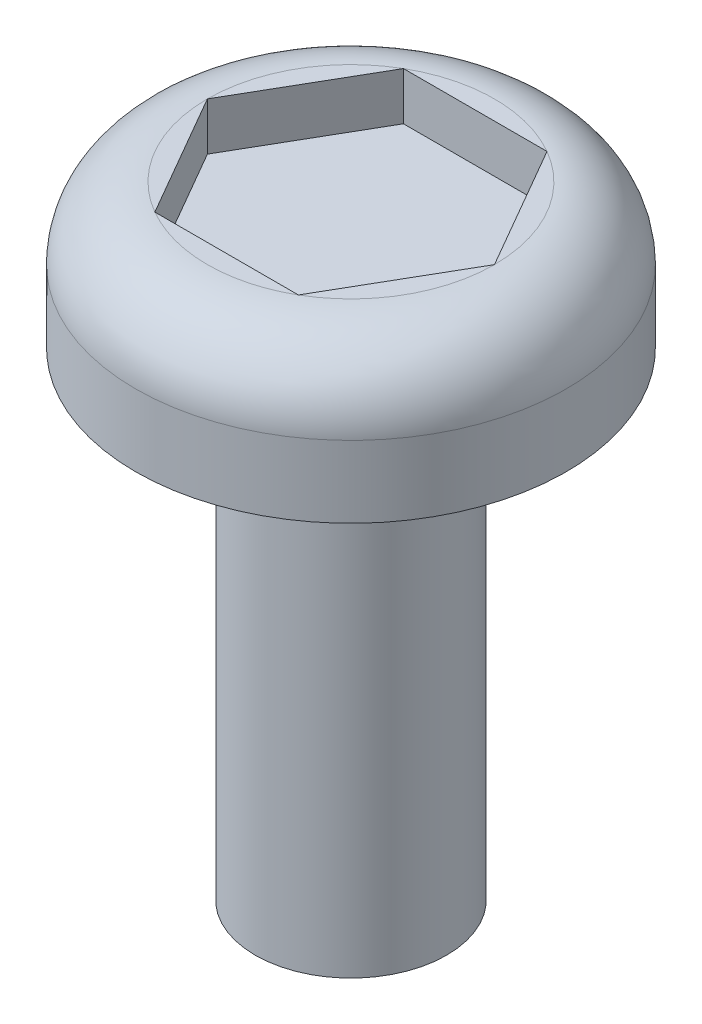
ISO-10303-21;
HEADER;
FILE_DESCRIPTION(('STEP AP214'),'2;1');
FILE_NAME('part.step','',(''),(''),'','','');
FILE_SCHEMA(('AUTOMOTIVE_DESIGN { 1 0 10303 214 1 1 1 1 }'));
ENDSEC;
DATA;
#1=APPLICATION_CONTEXT('core data for automotive mechanical design processes');
#2=APPLICATION_PROTOCOL_DEFINITION('international standard','automotive_design',2000,#1);
#3=PRODUCT_CONTEXT('',#1,'mechanical');
#4=PRODUCT('Part','Part','',(#3));
#5=PRODUCT_RELATED_PRODUCT_CATEGORY('part','',(#4));
#6=PRODUCT_DEFINITION_FORMATION('','',#4);
#7=PRODUCT_DEFINITION_CONTEXT('part definition',#1,'design');
#8=PRODUCT_DEFINITION('design','',#6,#7);
#9=PRODUCT_DEFINITION_SHAPE('','',#8);
#10=(LENGTH_UNIT() NAMED_UNIT(*) SI_UNIT(.MILLI.,.METRE.));
#11=(NAMED_UNIT(*) PLANE_ANGLE_UNIT() SI_UNIT($,.RADIAN.));
#12=(NAMED_UNIT(*) SI_UNIT($,.STERADIAN.) SOLID_ANGLE_UNIT());
#13=UNCERTAINTY_MEASURE_WITH_UNIT(LENGTH_MEASURE(1.E-05),#10,'distance_accuracy_value','');
#14=(GEOMETRIC_REPRESENTATION_CONTEXT(3) GLOBAL_UNCERTAINTY_ASSIGNED_CONTEXT((#13)) GLOBAL_UNIT_ASSIGNED_CONTEXT((#10,
#11,#12)) REPRESENTATION_CONTEXT('',''));
#15=CARTESIAN_POINT('',(0.,0.,0.));
#16=DIRECTION('',(0.,0.,1.));
#17=DIRECTION('',(1.,0.,0.));
#18=AXIS2_PLACEMENT_3D('',#15,#16,#17);
#19=CARTESIAN_POINT('',(0.,6.5,0.));
#20=DIRECTION('',(0.,1.,0.));
#21=DIRECTION('',(0.,0.,1.));
#22=AXIS2_PLACEMENT_3D('',#19,#20,#21);
#23=PLANE('',#22);
#24=DIRECTION('',(0.5,0.,-0.866025403784439));
#25=VECTOR('',#24,1.);
#26=CARTESIAN_POINT('',(0.75,6.5,1.29903810567666));
#27=LINE('',#26,#25);
#28=CARTESIAN_POINT('',(0.75,6.5,1.29903810567666));
#29=VERTEX_POINT('',#28);
#30=CARTESIAN_POINT('',(1.5,6.5,0.));
#31=VERTEX_POINT('',#30);
#32=EDGE_CURVE('E50',#29,#31,#27,.T.);
#33=ORIENTED_EDGE('',*,*,#32,.F.);
#34=CARTESIAN_POINT('',(0.,6.5,0.));
#35=DIRECTION('',(0.,1.,0.));
#36=DIRECTION('',(0.,0.,1.));
#37=AXIS2_PLACEMENT_3D('',#34,#35,#36);
#38=CIRCLE('',#37,1.5);
#39=EDGE_CURVE('E43',#29,#31,#38,.T.);
#40=ORIENTED_EDGE('',*,*,#39,.T.);
#41=EDGE_LOOP('',(#33,#40));
#42=FACE_BOUND('',#41,.T.);
#43=ADVANCED_FACE('F35',(#42),#23,.T.);
#44=DIRECTION('',(1.,0.,0.));
#45=VECTOR('',#44,1.);
#46=CARTESIAN_POINT('',(-0.75,6.5,1.29903810567666));
#47=LINE('',#46,#45);
#48=CARTESIAN_POINT('',(-0.75,6.5,1.29903810567666));
#49=VERTEX_POINT('',#48);
#50=EDGE_CURVE('E133',#49,#29,#47,.T.);
#51=ORIENTED_EDGE('',*,*,#50,.F.);
#52=EDGE_CURVE('E149',#49,#29,#38,.T.);
#53=ORIENTED_EDGE('',*,*,#52,.T.);
#54=EDGE_LOOP('',(#51,#53));
#55=FACE_BOUND('',#54,.T.);
#56=ADVANCED_FACE('F196',(#55),#23,.T.);
#57=DIRECTION('',(0.5,0.,0.866025403784439));
#58=VECTOR('',#57,1.);
#59=CARTESIAN_POINT('',(-1.5,6.5,0.));
#60=LINE('',#59,#58);
#61=CARTESIAN_POINT('',(-1.5,6.5,0.));
#62=VERTEX_POINT('',#61);
#63=EDGE_CURVE('E131',#62,#49,#60,.T.);
#64=ORIENTED_EDGE('',*,*,#63,.F.);
#65=EDGE_CURVE('E158',#62,#49,#38,.T.);
#66=ORIENTED_EDGE('',*,*,#65,.T.);
#67=EDGE_LOOP('',(#64,#66));
#68=FACE_BOUND('',#67,.T.);
#69=ADVANCED_FACE('F201',(#68),#23,.T.);
#70=DIRECTION('',(-0.5,0.,0.866025403784439));
#71=VECTOR('',#70,1.);
#72=CARTESIAN_POINT('',(-0.75,6.5,-1.29903810567666));
#73=LINE('',#72,#71);
#74=CARTESIAN_POINT('',(-0.75,6.5,-1.29903810567666));
#75=VERTEX_POINT('',#74);
#76=EDGE_CURVE('E98',#75,#62,#73,.T.);
#77=ORIENTED_EDGE('',*,*,#76,.F.);
#78=EDGE_CURVE('E163',#75,#62,#38,.T.);
#79=ORIENTED_EDGE('',*,*,#78,.T.);
#80=EDGE_LOOP('',(#77,#79));
#81=FACE_BOUND('',#80,.T.);
#82=ADVANCED_FACE('F215',(#81),#23,.T.);
#83=DIRECTION('',(-1.,0.,0.));
#84=VECTOR('',#83,1.);
#85=CARTESIAN_POINT('',(0.75,6.5,-1.29903810567666));
#86=LINE('',#85,#84);
#87=CARTESIAN_POINT('',(0.75,6.5,-1.29903810567666));
#88=VERTEX_POINT('',#87);
#89=EDGE_CURVE('E127',#88,#75,#86,.T.);
#90=ORIENTED_EDGE('',*,*,#89,.F.);
#91=EDGE_CURVE('E156',#88,#75,#38,.T.);
#92=ORIENTED_EDGE('',*,*,#91,.T.);
#93=EDGE_LOOP('',(#90,#92));
#94=FACE_BOUND('',#93,.T.);
#95=ADVANCED_FACE('F173',(#94),#23,.T.);
#96=CARTESIAN_POINT('',(0.,5.,0.));
#97=DIRECTION('',(0.,-1.,0.));
#98=DIRECTION('',(0.,0.,-1.));
#99=AXIS2_PLACEMENT_3D('',#96,#97,#98);
#100=CYLINDRICAL_SURFACE('',#99,1.);
#101=CARTESIAN_POINT('',(0.,5.,0.));
#102=DIRECTION('',(0.,1.,0.));
#103=DIRECTION('',(0.,0.,1.));
#104=AXIS2_PLACEMENT_3D('',#101,#102,#103);
#105=CIRCLE('',#104,1.);
#106=CARTESIAN_POINT('',(0.,5.,1.));
#107=VERTEX_POINT('',#106);
#108=EDGE_CURVE('E146',#107,#107,#105,.T.);
#109=ORIENTED_EDGE('',*,*,#108,.F.);
#110=EDGE_LOOP('',(#109));
#111=FACE_BOUND('',#110,.T.);
#112=CARTESIAN_POINT('',(0.,0.,0.));
#113=DIRECTION('',(0.,1.,0.));
#114=DIRECTION('',(0.,0.,1.));
#115=AXIS2_PLACEMENT_3D('',#112,#113,#114);
#116=CIRCLE('',#115,1.);
#117=CARTESIAN_POINT('',(0.,0.,1.));
#118=VERTEX_POINT('',#117);
#119=EDGE_CURVE('E145',#118,#118,#116,.T.);
#120=ORIENTED_EDGE('',*,*,#119,.T.);
#121=EDGE_LOOP('',(#120));
#122=FACE_BOUND('',#121,.T.);
#123=ADVANCED_FACE('F214',(#111,#122),#100,.T.);
#124=CARTESIAN_POINT('',(0.,0.,0.));
#125=DIRECTION('',(0.,1.,0.));
#126=DIRECTION('',(0.,0.,1.));
#127=AXIS2_PLACEMENT_3D('',#124,#125,#126);
#128=PLANE('',#127);
#129=ORIENTED_EDGE('',*,*,#119,.F.);
#130=EDGE_LOOP('',(#129));
#131=FACE_BOUND('',#130,.T.);
#132=ADVANCED_FACE('F210',(#131),#128,.F.);
#133=CARTESIAN_POINT('',(0.,6.5,0.));
#134=DIRECTION('',(0.,-1.,0.));
#135=DIRECTION('',(0.,0.,-1.));
#136=AXIS2_PLACEMENT_3D('',#133,#134,#135);
#137=CYLINDRICAL_SURFACE('',#136,2.25);
#138=CARTESIAN_POINT('',(0.,5.75,0.));
#139=DIRECTION('',(0.,1.,0.));
#140=DIRECTION('',(0.,0.,1.));
#141=AXIS2_PLACEMENT_3D('',#138,#139,#140);
#142=CIRCLE('',#141,2.25);
#143=CARTESIAN_POINT('',(0.,5.75,2.25));
#144=VERTEX_POINT('',#143);
#145=EDGE_CURVE('E11',#144,#144,#142,.F.);
#146=ORIENTED_EDGE('',*,*,#145,.T.);
#147=EDGE_LOOP('',(#146));
#148=FACE_BOUND('',#147,.T.);
#149=CARTESIAN_POINT('',(0.,5.,0.));
#150=DIRECTION('',(0.,1.,0.));
#151=DIRECTION('',(0.,0.,1.));
#152=AXIS2_PLACEMENT_3D('',#149,#150,#151);
#153=CIRCLE('',#152,2.25);
#154=CARTESIAN_POINT('',(0.,5.,2.25));
#155=VERTEX_POINT('',#154);
#156=EDGE_CURVE('E137',#155,#155,#153,.T.);
#157=ORIENTED_EDGE('',*,*,#156,.T.);
#158=EDGE_LOOP('',(#157));
#159=FACE_BOUND('',#158,.T.);
#160=ADVANCED_FACE('F204',(#148,#159),#137,.T.);
#161=DIRECTION('',(-0.5,0.,-0.866025403784439));
#162=VECTOR('',#161,1.);
#163=CARTESIAN_POINT('',(1.5,6.5,0.));
#164=LINE('',#163,#162);
#165=EDGE_CURVE('E124',#31,#88,#164,.T.);
#166=ORIENTED_EDGE('',*,*,#165,.F.);
#167=EDGE_CURVE('E152',#31,#88,#38,.T.);
#168=ORIENTED_EDGE('',*,*,#167,.T.);
#169=EDGE_LOOP('',(#166,#168));
#170=FACE_BOUND('',#169,.T.);
#171=ADVANCED_FACE('F178',(#170),#23,.T.);
#172=CARTESIAN_POINT('',(0.,5.,0.));
#173=DIRECTION('',(0.,1.,0.));
#174=DIRECTION('',(0.,0.,1.));
#175=AXIS2_PLACEMENT_3D('',#172,#173,#174);
#176=PLANE('',#175);
#177=ORIENTED_EDGE('',*,*,#108,.T.);
#178=EDGE_LOOP('',(#177));
#179=FACE_BOUND('',#178,.T.);
#180=ORIENTED_EDGE('',*,*,#156,.F.);
#181=EDGE_LOOP('',(#180));
#182=FACE_BOUND('',#181,.T.);
#183=ADVANCED_FACE('F191',(#179,#182),#176,.F.);
#184=CARTESIAN_POINT('',(0.,5.75,0.));
#185=DIRECTION('',(0.,1.,0.));
#186=DIRECTION('',(0.,0.,1.));
#187=AXIS2_PLACEMENT_3D('',#184,#185,#186);
#188=TOROIDAL_SURFACE('',#187,1.5,0.75);
#189=ORIENTED_EDGE('',*,*,#145,.F.);
#190=EDGE_LOOP('',(#189));
#191=FACE_BOUND('',#190,.T.);
#192=ORIENTED_EDGE('',*,*,#39,.F.);
#193=ORIENTED_EDGE('',*,*,#52,.F.);
#194=ORIENTED_EDGE('',*,*,#65,.F.);
#195=ORIENTED_EDGE('',*,*,#78,.F.);
#196=ORIENTED_EDGE('',*,*,#91,.F.);
#197=ORIENTED_EDGE('',*,*,#167,.F.);
#198=EDGE_LOOP('',(#192,#193,#194,#195,#196,#197));
#199=FACE_BOUND('',#198,.T.);
#200=ADVANCED_FACE('F37',(#191,#199),#188,.T.);
#201=CARTESIAN_POINT('',(0.75,6.,1.29903810567666));
#202=DIRECTION('',(0.866025403784439,0.,0.5));
#203=DIRECTION('',(0.5,0.,-0.866025403784439));
#204=AXIS2_PLACEMENT_3D('',#201,#202,#203);
#205=PLANE('',#204);
#206=ORIENTED_EDGE('',*,*,#32,.T.);
#207=DIRECTION('',(0.,1.,0.));
#208=VECTOR('',#207,1.);
#209=CARTESIAN_POINT('',(1.5,6.,0.));
#210=LINE('',#209,#208);
#211=CARTESIAN_POINT('',(1.5,6.,0.));
#212=VERTEX_POINT('',#211);
#213=EDGE_CURVE('E80',#212,#31,#210,.T.);
#214=ORIENTED_EDGE('',*,*,#213,.F.);
#215=DIRECTION('',(0.5,0.,-0.866025403784439));
#216=VECTOR('',#215,1.);
#217=CARTESIAN_POINT('',(0.75,6.,1.29903810567666));
#218=LINE('',#217,#216);
#219=CARTESIAN_POINT('',(0.75,6.,1.29903810567666));
#220=VERTEX_POINT('',#219);
#221=EDGE_CURVE('E135',#220,#212,#218,.T.);
#222=ORIENTED_EDGE('',*,*,#221,.F.);
#223=DIRECTION('',(0.,1.,0.));
#224=VECTOR('',#223,1.);
#225=CARTESIAN_POINT('',(0.75,6.,1.29903810567666));
#226=LINE('',#225,#224);
#227=EDGE_CURVE('E58',#220,#29,#226,.T.);
#228=ORIENTED_EDGE('',*,*,#227,.T.);
#229=EDGE_LOOP('',(#206,#214,#222,#228));
#230=FACE_BOUND('',#229,.T.);
#231=ADVANCED_FACE('F182',(#230),#205,.F.);
#232=CARTESIAN_POINT('',(-0.75,6.,1.29903810567666));
#233=DIRECTION('',(0.,0.,1.));
#234=DIRECTION('',(1.,0.,0.));
#235=AXIS2_PLACEMENT_3D('',#232,#233,#234);
#236=PLANE('',#235);
#237=ORIENTED_EDGE('',*,*,#50,.T.);
#238=ORIENTED_EDGE('',*,*,#227,.F.);
#239=DIRECTION('',(1.,0.,0.));
#240=VECTOR('',#239,1.);
#241=CARTESIAN_POINT('',(-0.75,6.,1.29903810567666));
#242=LINE('',#241,#240);
#243=CARTESIAN_POINT('',(-0.75,6.,1.29903810567666));
#244=VERTEX_POINT('',#243);
#245=EDGE_CURVE('E110',#244,#220,#242,.T.);
#246=ORIENTED_EDGE('',*,*,#245,.F.);
#247=DIRECTION('',(0.,1.,0.));
#248=VECTOR('',#247,1.);
#249=CARTESIAN_POINT('',(-0.75,6.,1.29903810567666));
#250=LINE('',#249,#248);
#251=EDGE_CURVE('E102',#244,#49,#250,.T.);
#252=ORIENTED_EDGE('',*,*,#251,.T.);
#253=EDGE_LOOP('',(#237,#238,#246,#252));
#254=FACE_BOUND('',#253,.T.);
#255=ADVANCED_FACE('F184',(#254),#236,.F.);
#256=CARTESIAN_POINT('',(-1.5,6.,0.));
#257=DIRECTION('',(-0.866025403784439,0.,0.5));
#258=DIRECTION('',(0.5,0.,0.866025403784439));
#259=AXIS2_PLACEMENT_3D('',#256,#257,#258);
#260=PLANE('',#259);
#261=ORIENTED_EDGE('',*,*,#63,.T.);
#262=ORIENTED_EDGE('',*,*,#251,.F.);
#263=DIRECTION('',(0.5,0.,0.866025403784439));
#264=VECTOR('',#263,1.);
#265=CARTESIAN_POINT('',(-1.5,6.,0.));
#266=LINE('',#265,#264);
#267=CARTESIAN_POINT('',(-1.5,6.,0.));
#268=VERTEX_POINT('',#267);
#269=EDGE_CURVE('E106',#268,#244,#266,.T.);
#270=ORIENTED_EDGE('',*,*,#269,.F.);
#271=DIRECTION('',(0.,1.,0.));
#272=VECTOR('',#271,1.);
#273=CARTESIAN_POINT('',(-1.5,6.,0.));
#274=LINE('',#273,#272);
#275=EDGE_CURVE('E91',#268,#62,#274,.T.);
#276=ORIENTED_EDGE('',*,*,#275,.T.);
#277=EDGE_LOOP('',(#261,#262,#270,#276));
#278=FACE_BOUND('',#277,.T.);
#279=ADVANCED_FACE('F107',(#278),#260,.F.);
#280=CARTESIAN_POINT('',(-0.75,6.,-1.29903810567666));
#281=DIRECTION('',(-0.866025403784439,0.,-0.5));
#282=DIRECTION('',(-0.5,0.,0.866025403784439));
#283=AXIS2_PLACEMENT_3D('',#280,#281,#282);
#284=PLANE('',#283);
#285=ORIENTED_EDGE('',*,*,#76,.T.);
#286=ORIENTED_EDGE('',*,*,#275,.F.);
#287=DIRECTION('',(-0.5,0.,0.866025403784439));
#288=VECTOR('',#287,1.);
#289=CARTESIAN_POINT('',(-0.75,6.,-1.29903810567666));
#290=LINE('',#289,#288);
#291=CARTESIAN_POINT('',(-0.75,6.,-1.29903810567666));
#292=VERTEX_POINT('',#291);
#293=EDGE_CURVE('E95',#292,#268,#290,.T.);
#294=ORIENTED_EDGE('',*,*,#293,.F.);
#295=DIRECTION('',(0.,1.,0.));
#296=VECTOR('',#295,1.);
#297=CARTESIAN_POINT('',(-0.75,6.,-1.29903810567666));
#298=LINE('',#297,#296);
#299=EDGE_CURVE('E103',#292,#75,#298,.T.);
#300=ORIENTED_EDGE('',*,*,#299,.T.);
#301=EDGE_LOOP('',(#285,#286,#294,#300));
#302=FACE_BOUND('',#301,.T.);
#303=ADVANCED_FACE('F93',(#302),#284,.F.);
#304=CARTESIAN_POINT('',(0.75,6.,-1.29903810567666));
#305=DIRECTION('',(0.,0.,-1.));
#306=DIRECTION('',(-1.,0.,0.));
#307=AXIS2_PLACEMENT_3D('',#304,#305,#306);
#308=PLANE('',#307);
#309=ORIENTED_EDGE('',*,*,#89,.T.);
#310=ORIENTED_EDGE('',*,*,#299,.F.);
#311=DIRECTION('',(-1.,0.,0.));
#312=VECTOR('',#311,1.);
#313=CARTESIAN_POINT('',(0.75,6.,-1.29903810567666));
#314=LINE('',#313,#312);
#315=CARTESIAN_POINT('',(0.75,6.,-1.29903810567666));
#316=VERTEX_POINT('',#315);
#317=EDGE_CURVE('E116',#316,#292,#314,.T.);
#318=ORIENTED_EDGE('',*,*,#317,.F.);
#319=DIRECTION('',(0.,1.,0.));
#320=VECTOR('',#319,1.);
#321=CARTESIAN_POINT('',(0.75,6.,-1.29903810567666));
#322=LINE('',#321,#320);
#323=EDGE_CURVE('E140',#316,#88,#322,.T.);
#324=ORIENTED_EDGE('',*,*,#323,.T.);
#325=EDGE_LOOP('',(#309,#310,#318,#324));
#326=FACE_BOUND('',#325,.T.);
#327=ADVANCED_FACE('F298',(#326),#308,.F.);
#328=CARTESIAN_POINT('',(1.5,6.,0.));
#329=DIRECTION('',(0.866025403784439,0.,-0.5));
#330=DIRECTION('',(-0.5,0.,-0.866025403784439));
#331=AXIS2_PLACEMENT_3D('',#328,#329,#330);
#332=PLANE('',#331);
#333=ORIENTED_EDGE('',*,*,#165,.T.);
#334=ORIENTED_EDGE('',*,*,#323,.F.);
#335=DIRECTION('',(-0.5,0.,-0.866025403784439));
#336=VECTOR('',#335,1.);
#337=CARTESIAN_POINT('',(1.5,6.,0.));
#338=LINE('',#337,#336);
#339=EDGE_CURVE('E118',#212,#316,#338,.T.);
#340=ORIENTED_EDGE('',*,*,#339,.F.);
#341=ORIENTED_EDGE('',*,*,#213,.T.);
#342=EDGE_LOOP('',(#333,#334,#340,#341));
#343=FACE_BOUND('',#342,.T.);
#344=ADVANCED_FACE('F180',(#343),#332,.F.);
#345=CARTESIAN_POINT('',(0.,6.,0.));
#346=DIRECTION('',(0.,1.,0.));
#347=DIRECTION('',(0.,0.,1.));
#348=AXIS2_PLACEMENT_3D('',#345,#346,#347);
#349=PLANE('',#348);
#350=ORIENTED_EDGE('',*,*,#221,.T.);
#351=ORIENTED_EDGE('',*,*,#339,.T.);
#352=ORIENTED_EDGE('',*,*,#317,.T.);
#353=ORIENTED_EDGE('',*,*,#293,.T.);
#354=ORIENTED_EDGE('',*,*,#269,.T.);
#355=ORIENTED_EDGE('',*,*,#245,.T.);
#356=EDGE_LOOP('',(#350,#351,#352,#353,#354,#355));
#357=FACE_BOUND('',#356,.T.);
#358=ADVANCED_FACE('F113',(#357),#349,.T.);
#359=CLOSED_SHELL('',(#43,#56,#69,#82,#95,#123,#132,#160,#171,#183,#200,#231,#255,#279,#303,
#327,#344,#358));
#360=MANIFOLD_SOLID_BREP('B2',#359);
#361=ADVANCED_BREP_SHAPE_REPRESENTATION('',(#18,#360),#14);
#362=SHAPE_DEFINITION_REPRESENTATION(#9,#361);
ENDSEC;
END-ISO-10303-21;
